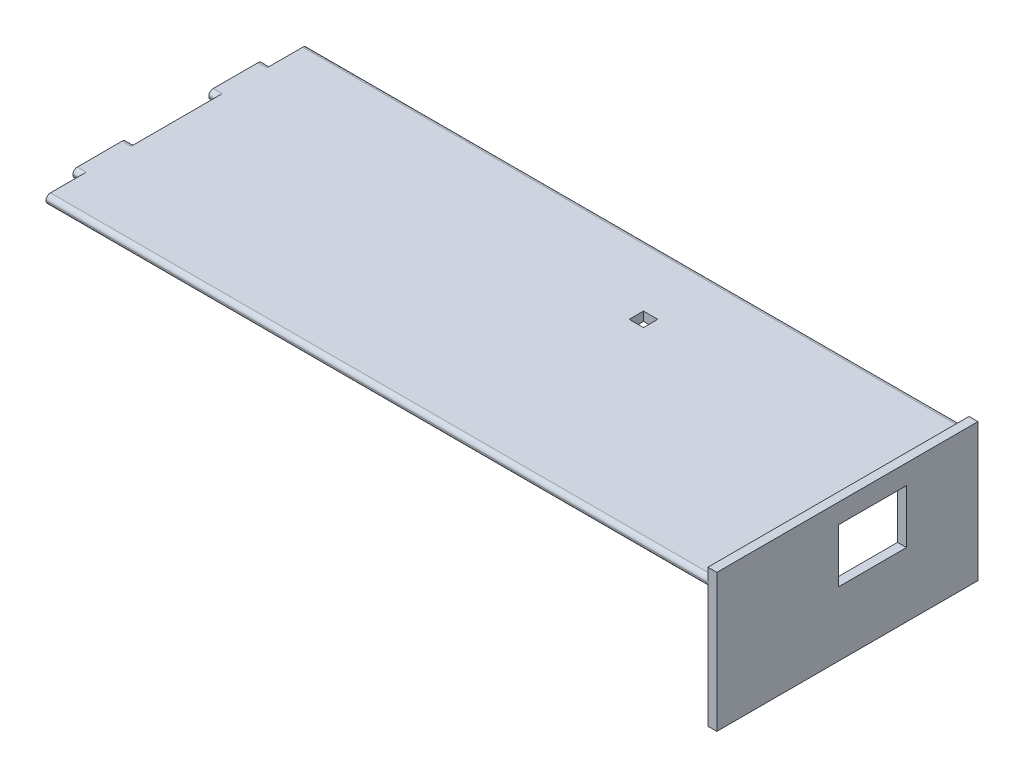
ISO-10303-21;
HEADER;
FILE_DESCRIPTION(('STEP AP214'),'2;1');
FILE_NAME('part.step','',(''),(''),'','','');
FILE_SCHEMA(('AUTOMOTIVE_DESIGN { 1 0 10303 214 1 1 1 1 }'));
ENDSEC;
DATA;
#1=APPLICATION_CONTEXT('core data for automotive mechanical design processes');
#2=APPLICATION_PROTOCOL_DEFINITION('international standard','automotive_design',2000,#1);
#3=PRODUCT_CONTEXT('',#1,'mechanical');
#4=PRODUCT('Part','Part','',(#3));
#5=PRODUCT_RELATED_PRODUCT_CATEGORY('part','',(#4));
#6=PRODUCT_DEFINITION_FORMATION('','',#4);
#7=PRODUCT_DEFINITION_CONTEXT('part definition',#1,'design');
#8=PRODUCT_DEFINITION('design','',#6,#7);
#9=PRODUCT_DEFINITION_SHAPE('','',#8);
#10=(LENGTH_UNIT() NAMED_UNIT(*) SI_UNIT(.MILLI.,.METRE.));
#11=(NAMED_UNIT(*) PLANE_ANGLE_UNIT() SI_UNIT($,.RADIAN.));
#12=(NAMED_UNIT(*) SI_UNIT($,.STERADIAN.) SOLID_ANGLE_UNIT());
#13=UNCERTAINTY_MEASURE_WITH_UNIT(LENGTH_MEASURE(1.E-05),#10,'distance_accuracy_value','');
#14=(GEOMETRIC_REPRESENTATION_CONTEXT(3) GLOBAL_UNCERTAINTY_ASSIGNED_CONTEXT((#13)) GLOBAL_UNIT_ASSIGNED_CONTEXT((#10,
#11,#12)) REPRESENTATION_CONTEXT('',''));
#15=CARTESIAN_POINT('',(0.,0.,0.));
#16=DIRECTION('',(0.,0.,1.));
#17=DIRECTION('',(1.,0.,0.));
#18=AXIS2_PLACEMENT_3D('',#15,#16,#17);
#19=CARTESIAN_POINT('',(-87.0064794816415,2.5,-44.1074514038877));
#20=DIRECTION('',(1.,0.,0.));
#21=DIRECTION('',(0.,0.,-1.));
#22=AXIS2_PLACEMENT_3D('',#19,#20,#21);
#23=PLANE('',#22);
#24=DIRECTION('',(0.,0.,1.));
#25=VECTOR('',#24,1.);
#26=CARTESIAN_POINT('',(-87.0064794816415,0.,-44.1074514038877));
#27=LINE('',#26,#25);
#28=CARTESIAN_POINT('',(-87.0064794816415,0.,-20.3574514038877));
#29=VERTEX_POINT('',#28);
#30=CARTESIAN_POINT('',(-87.0064794816415,0.,5.1425485961123));
#31=VERTEX_POINT('',#30);
#32=EDGE_CURVE('E362',#29,#31,#27,.T.);
#33=ORIENTED_EDGE('',*,*,#32,.T.);
#34=CARTESIAN_POINT('',(-87.0064794816415,1.25,5.1425485961123));
#35=DIRECTION('',(1.,0.,0.));
#36=DIRECTION('',(0.,0.,-1.));
#37=AXIS2_PLACEMENT_3D('',#34,#35,#36);
#38=CIRCLE('',#37,1.25);
#39=CARTESIAN_POINT('',(-87.0064794816415,1.25,3.8925485961123));
#40=VERTEX_POINT('',#39);
#41=EDGE_CURVE('E405',#31,#40,#38,.T.);
#42=ORIENTED_EDGE('',*,*,#41,.T.);
#43=CARTESIAN_POINT('',(-87.0064794816415,1.25,5.1425485961123));
#44=DIRECTION('',(1.,0.,0.));
#45=DIRECTION('',(0.,0.,-1.));
#46=AXIS2_PLACEMENT_3D('',#43,#44,#45);
#47=CIRCLE('',#46,1.25);
#48=CARTESIAN_POINT('',(-87.0064794816415,2.5,5.1425485961123));
#49=VERTEX_POINT('',#48);
#50=EDGE_CURVE('E402',#40,#49,#47,.T.);
#51=ORIENTED_EDGE('',*,*,#50,.T.);
#52=DIRECTION('',(0.,0.,1.));
#53=VECTOR('',#52,1.);
#54=CARTESIAN_POINT('',(-87.0064794816415,2.5,-44.1074514038877));
#55=LINE('',#54,#53);
#56=CARTESIAN_POINT('',(-87.0064794816415,2.5,-20.3574514038877));
#57=VERTEX_POINT('',#56);
#58=EDGE_CURVE('E354',#57,#49,#55,.T.);
#59=ORIENTED_EDGE('',*,*,#58,.F.);
#60=CARTESIAN_POINT('',(-87.0064794816415,1.25,-20.3574514038877));
#61=DIRECTION('',(1.,0.,0.));
#62=DIRECTION('',(0.,0.,-1.));
#63=AXIS2_PLACEMENT_3D('',#60,#61,#62);
#64=CIRCLE('',#63,1.25);
#65=CARTESIAN_POINT('',(-87.0064794816415,1.25,-19.1074514038877));
#66=VERTEX_POINT('',#65);
#67=EDGE_CURVE('E414',#57,#66,#64,.T.);
#68=ORIENTED_EDGE('',*,*,#67,.T.);
#69=CARTESIAN_POINT('',(-87.0064794816415,1.25,-20.3574514038877));
#70=DIRECTION('',(1.,0.,0.));
#71=DIRECTION('',(0.,0.,-1.));
#72=AXIS2_PLACEMENT_3D('',#69,#70,#71);
#73=CIRCLE('',#72,1.25);
#74=EDGE_CURVE('E416',#66,#29,#73,.T.);
#75=ORIENTED_EDGE('',*,*,#74,.T.);
#76=EDGE_LOOP('',(#33,#42,#51,#59,#68,#75));
#77=FACE_BOUND('',#76,.T.);
#78=ADVANCED_FACE('F37',(#77),#23,.F.);
#79=CARTESIAN_POINT('',(-87.0064794816415,0.,17.6425485961123));
#80=VERTEX_POINT('',#79);
#81=CARTESIAN_POINT('',(-87.0064794816415,0.,27.6425485961123));
#82=VERTEX_POINT('',#81);
#83=EDGE_CURVE('E350',#80,#82,#27,.T.);
#84=ORIENTED_EDGE('',*,*,#83,.T.);
#85=CARTESIAN_POINT('',(-87.0064794816415,1.25,27.6425485961123));
#86=DIRECTION('',(1.,0.,0.));
#87=DIRECTION('',(0.,0.,-1.));
#88=AXIS2_PLACEMENT_3D('',#85,#86,#87);
#89=CIRCLE('',#88,1.25);
#90=CARTESIAN_POINT('',(-87.0064794816415,1.25,28.8925485961123));
#91=VERTEX_POINT('',#90);
#92=EDGE_CURVE('E448',#82,#91,#89,.F.);
#93=ORIENTED_EDGE('',*,*,#92,.T.);
#94=CARTESIAN_POINT('',(-87.0064794816415,1.25,27.6425485961123));
#95=DIRECTION('',(1.,0.,0.));
#96=DIRECTION('',(0.,0.,-1.));
#97=AXIS2_PLACEMENT_3D('',#94,#95,#96);
#98=CIRCLE('',#97,1.25);
#99=CARTESIAN_POINT('',(-87.0064794816415,2.5,27.6425485961123));
#100=VERTEX_POINT('',#99);
#101=EDGE_CURVE('E446',#91,#100,#98,.F.);
#102=ORIENTED_EDGE('',*,*,#101,.T.);
#103=CARTESIAN_POINT('',(-87.0064794816415,2.5,17.6425485961123));
#104=VERTEX_POINT('',#103);
#105=EDGE_CURVE('E355',#104,#100,#55,.T.);
#106=ORIENTED_EDGE('',*,*,#105,.F.);
#107=CARTESIAN_POINT('',(-87.0064794816415,1.25,17.6425485961123));
#108=DIRECTION('',(1.,0.,0.));
#109=DIRECTION('',(0.,0.,-1.));
#110=AXIS2_PLACEMENT_3D('',#107,#108,#109);
#111=CIRCLE('',#110,1.25);
#112=CARTESIAN_POINT('',(-87.0064794816415,1.25,18.8925485961123));
#113=VERTEX_POINT('',#112);
#114=EDGE_CURVE('E410',#104,#113,#111,.T.);
#115=ORIENTED_EDGE('',*,*,#114,.T.);
#116=CARTESIAN_POINT('',(-87.0064794816415,1.25,17.6425485961123));
#117=DIRECTION('',(1.,0.,0.));
#118=DIRECTION('',(0.,0.,-1.));
#119=AXIS2_PLACEMENT_3D('',#116,#117,#118);
#120=CIRCLE('',#119,1.25);
#121=EDGE_CURVE('E407',#113,#80,#120,.T.);
#122=ORIENTED_EDGE('',*,*,#121,.T.);
#123=EDGE_LOOP('',(#84,#93,#102,#106,#115,#122));
#124=FACE_BOUND('',#123,.T.);
#125=ADVANCED_FACE('F473',(#124),#23,.F.);
#126=CARTESIAN_POINT('',(-87.0064794816415,1.25,-42.8574514038877));
#127=DIRECTION('',(1.,0.,0.));
#128=DIRECTION('',(0.,0.,-1.));
#129=AXIS2_PLACEMENT_3D('',#126,#127,#128);
#130=CIRCLE('',#129,1.25);
#131=CARTESIAN_POINT('',(-87.0064794816415,2.5,-42.8574514038877));
#132=VERTEX_POINT('',#131);
#133=CARTESIAN_POINT('',(-87.0064794816415,1.25,-44.1074514038877));
#134=VERTEX_POINT('',#133);
#135=EDGE_CURVE('E422',#132,#134,#130,.F.);
#136=ORIENTED_EDGE('',*,*,#135,.T.);
#137=CARTESIAN_POINT('',(-87.0064794816415,1.25,-42.8574514038877));
#138=DIRECTION('',(1.,0.,0.));
#139=DIRECTION('',(0.,0.,-1.));
#140=AXIS2_PLACEMENT_3D('',#137,#138,#139);
#141=CIRCLE('',#140,1.25);
#142=CARTESIAN_POINT('',(-87.0064794816415,0.,-42.8574514038877));
#143=VERTEX_POINT('',#142);
#144=EDGE_CURVE('E434',#134,#143,#141,.F.);
#145=ORIENTED_EDGE('',*,*,#144,.T.);
#146=CARTESIAN_POINT('',(-87.0064794816415,0.,-32.8574514038877));
#147=VERTEX_POINT('',#146);
#148=EDGE_CURVE('E359',#143,#147,#27,.T.);
#149=ORIENTED_EDGE('',*,*,#148,.T.);
#150=CARTESIAN_POINT('',(-87.0064794816415,1.25,-32.8574514038877));
#151=DIRECTION('',(1.,0.,0.));
#152=DIRECTION('',(0.,0.,-1.));
#153=AXIS2_PLACEMENT_3D('',#150,#151,#152);
#154=CIRCLE('',#153,1.25);
#155=CARTESIAN_POINT('',(-87.0064794816415,1.25,-34.1074514038877));
#156=VERTEX_POINT('',#155);
#157=EDGE_CURVE('E412',#147,#156,#154,.T.);
#158=ORIENTED_EDGE('',*,*,#157,.T.);
#159=CARTESIAN_POINT('',(-87.0064794816415,1.25,-32.8574514038877));
#160=DIRECTION('',(1.,0.,0.));
#161=DIRECTION('',(0.,0.,-1.));
#162=AXIS2_PLACEMENT_3D('',#159,#160,#161);
#163=CIRCLE('',#162,1.25);
#164=CARTESIAN_POINT('',(-87.0064794816415,2.5,-32.8574514038877));
#165=VERTEX_POINT('',#164);
#166=EDGE_CURVE('E419',#156,#165,#163,.T.);
#167=ORIENTED_EDGE('',*,*,#166,.T.);
#168=EDGE_CURVE('E351',#132,#165,#55,.T.);
#169=ORIENTED_EDGE('',*,*,#168,.F.);
#170=EDGE_LOOP('',(#136,#145,#149,#158,#167,#169));
#171=FACE_BOUND('',#170,.T.);
#172=ADVANCED_FACE('F540',(#171),#23,.F.);
#173=CARTESIAN_POINT('',(-87.0064794816415,2.5,28.8925485961123));
#174=DIRECTION('',(0.,0.,-1.));
#175=DIRECTION('',(-1.,0.,0.));
#176=AXIS2_PLACEMENT_3D('',#173,#174,#175);
#177=PLANE('',#176);
#178=DIRECTION('',(0.,-1.,0.));
#179=VECTOR('',#178,1.);
#180=CARTESIAN_POINT('',(97.9935205183586,5.,28.8925485961123));
#181=LINE('',#180,#179);
#182=CARTESIAN_POINT('',(97.9935205183586,5.,28.8925485961123));
#183=VERTEX_POINT('',#182);
#184=CARTESIAN_POINT('',(97.9935205183586,1.25,28.8925485961123));
#185=VERTEX_POINT('',#184);
#186=EDGE_CURVE('E315',#183,#185,#181,.T.);
#187=ORIENTED_EDGE('',*,*,#186,.T.);
#188=CARTESIAN_POINT('',(97.9935205183586,-33.5,28.8925485961123));
#189=VERTEX_POINT('',#188);
#190=EDGE_CURVE('E318',#185,#189,#181,.T.);
#191=ORIENTED_EDGE('',*,*,#190,.T.);
#192=DIRECTION('',(-1.,0.,0.));
#193=VECTOR('',#192,1.);
#194=CARTESIAN_POINT('',(100.493520518359,-33.5,28.8925485961123));
#195=LINE('',#194,#193);
#196=CARTESIAN_POINT('',(100.493520518359,-33.5,28.8925485961123));
#197=VERTEX_POINT('',#196);
#198=EDGE_CURVE('E333',#197,#189,#195,.T.);
#199=ORIENTED_EDGE('',*,*,#198,.F.);
#200=DIRECTION('',(0.,-1.,0.));
#201=VECTOR('',#200,1.);
#202=CARTESIAN_POINT('',(100.493520518359,5.,28.8925485961123));
#203=LINE('',#202,#201);
#204=CARTESIAN_POINT('',(100.493520518359,5.,28.8925485961123));
#205=VERTEX_POINT('',#204);
#206=EDGE_CURVE('E304',#205,#197,#203,.T.);
#207=ORIENTED_EDGE('',*,*,#206,.F.);
#208=DIRECTION('',(-1.,0.,0.));
#209=VECTOR('',#208,1.);
#210=CARTESIAN_POINT('',(100.493520518359,5.,28.8925485961123));
#211=LINE('',#210,#209);
#212=EDGE_CURVE('E314',#205,#183,#211,.T.);
#213=ORIENTED_EDGE('',*,*,#212,.T.);
#214=EDGE_LOOP('',(#187,#191,#199,#207,#213));
#215=FACE_BOUND('',#214,.T.);
#216=ADVANCED_FACE('F567',(#215),#177,.F.);
#217=CARTESIAN_POINT('',(-87.0064794816415,2.5,-44.1074514038877));
#218=DIRECTION('',(0.,0.,1.));
#219=DIRECTION('',(1.,0.,0.));
#220=AXIS2_PLACEMENT_3D('',#217,#218,#219);
#221=PLANE('',#220);
#222=DIRECTION('',(0.,1.,0.));
#223=VECTOR('',#222,1.);
#224=CARTESIAN_POINT('',(97.9935205183586,5.,-44.1074514038877));
#225=LINE('',#224,#223);
#226=CARTESIAN_POINT('',(97.9935205183586,-33.5,-44.1074514038877));
#227=VERTEX_POINT('',#226);
#228=CARTESIAN_POINT('',(97.9935205183586,1.25,-44.1074514038877));
#229=VERTEX_POINT('',#228);
#230=EDGE_CURVE('E321',#227,#229,#225,.T.);
#231=ORIENTED_EDGE('',*,*,#230,.T.);
#232=CARTESIAN_POINT('',(97.9935205183586,5.,-44.1074514038877));
#233=VERTEX_POINT('',#232);
#234=EDGE_CURVE('E320',#229,#233,#225,.T.);
#235=ORIENTED_EDGE('',*,*,#234,.T.);
#236=DIRECTION('',(-1.,0.,0.));
#237=VECTOR('',#236,1.);
#238=CARTESIAN_POINT('',(100.493520518359,5.,-44.1074514038877));
#239=LINE('',#238,#237);
#240=CARTESIAN_POINT('',(100.493520518359,5.,-44.1074514038877));
#241=VERTEX_POINT('',#240);
#242=EDGE_CURVE('E327',#241,#233,#239,.T.);
#243=ORIENTED_EDGE('',*,*,#242,.F.);
#244=DIRECTION('',(0.,1.,0.));
#245=VECTOR('',#244,1.);
#246=CARTESIAN_POINT('',(100.493520518359,5.,-44.1074514038877));
#247=LINE('',#246,#245);
#248=CARTESIAN_POINT('',(100.493520518359,-33.5,-44.1074514038877));
#249=VERTEX_POINT('',#248);
#250=EDGE_CURVE('E310',#249,#241,#247,.T.);
#251=ORIENTED_EDGE('',*,*,#250,.F.);
#252=DIRECTION('',(-1.,0.,0.));
#253=VECTOR('',#252,1.);
#254=CARTESIAN_POINT('',(100.493520518359,-33.5,-44.1074514038877));
#255=LINE('',#254,#253);
#256=EDGE_CURVE('E330',#249,#227,#255,.T.);
#257=ORIENTED_EDGE('',*,*,#256,.T.);
#258=EDGE_LOOP('',(#231,#235,#243,#251,#257));
#259=FACE_BOUND('',#258,.T.);
#260=ADVANCED_FACE('F571',(#259),#221,.F.);
#261=CARTESIAN_POINT('',(0.,2.5,0.));
#262=DIRECTION('',(0.,1.,0.));
#263=DIRECTION('',(0.,0.,1.));
#264=AXIS2_PLACEMENT_3D('',#261,#262,#263);
#265=PLANE('',#264);
#266=DIRECTION('',(0.,0.,1.));
#267=VECTOR('',#266,1.);
#268=CARTESIAN_POINT('',(24.4935205183586,2.5,-26.6074514038877));
#269=LINE('',#268,#267);
#270=CARTESIAN_POINT('',(24.4935205183586,2.5,-26.6074514038877));
#271=VERTEX_POINT('',#270);
#272=CARTESIAN_POINT('',(24.4935205183586,2.5,-22.6074514038877));
#273=VERTEX_POINT('',#272);
#274=EDGE_CURVE('E54',#271,#273,#269,.T.);
#275=ORIENTED_EDGE('',*,*,#274,.F.);
#276=DIRECTION('',(-1.,0.,0.));
#277=VECTOR('',#276,1.);
#278=CARTESIAN_POINT('',(24.4935205183586,2.5,-26.6074514038877));
#279=LINE('',#278,#277);
#280=CARTESIAN_POINT('',(28.4935205183586,2.5,-26.6074514038877));
#281=VERTEX_POINT('',#280);
#282=EDGE_CURVE('E254',#281,#271,#279,.T.);
#283=ORIENTED_EDGE('',*,*,#282,.F.);
#284=DIRECTION('',(0.,0.,-1.));
#285=VECTOR('',#284,1.);
#286=CARTESIAN_POINT('',(28.4935205183586,2.5,-26.6074514038877));
#287=LINE('',#286,#285);
#288=CARTESIAN_POINT('',(28.4935205183586,2.5,-22.6074514038877));
#289=VERTEX_POINT('',#288);
#290=EDGE_CURVE('E257',#289,#281,#287,.T.);
#291=ORIENTED_EDGE('',*,*,#290,.F.);
#292=DIRECTION('',(1.,0.,0.));
#293=VECTOR('',#292,1.);
#294=CARTESIAN_POINT('',(24.4935205183586,2.5,-22.6074514038877));
#295=LINE('',#294,#293);
#296=EDGE_CURVE('E263',#273,#289,#295,.T.);
#297=ORIENTED_EDGE('',*,*,#296,.F.);
#298=EDGE_LOOP('',(#275,#283,#291,#297));
#299=FACE_BOUND('',#298,.T.);
#300=DIRECTION('',(0.,0.,-1.));
#301=VECTOR('',#300,1.);
#302=CARTESIAN_POINT('',(97.9935205183586,2.5,-44.1074514038877));
#303=LINE('',#302,#301);
#304=CARTESIAN_POINT('',(97.9935205183586,2.5,27.6425485961123));
#305=VERTEX_POINT('',#304);
#306=CARTESIAN_POINT('',(97.9935205183586,2.5,-42.8574514038877));
#307=VERTEX_POINT('',#306);
#308=EDGE_CURVE('E353',#305,#307,#303,.T.);
#309=ORIENTED_EDGE('',*,*,#308,.T.);
#310=DIRECTION('',(-1.,0.,0.));
#311=VECTOR('',#310,1.);
#312=CARTESIAN_POINT('',(-87.0064794816415,2.5,-42.8574514038877));
#313=LINE('',#312,#311);
#314=EDGE_CURVE('E444',#307,#132,#313,.T.);
#315=ORIENTED_EDGE('',*,*,#314,.T.);
#316=ORIENTED_EDGE('',*,*,#168,.T.);
#317=DIRECTION('',(1.,0.,0.));
#318=VECTOR('',#317,1.);
#319=CARTESIAN_POINT('',(-89.5064794816415,2.5,-32.8574514038877));
#320=LINE('',#319,#318);
#321=CARTESIAN_POINT('',(-89.5064794816415,2.5,-32.8574514038877));
#322=VERTEX_POINT('',#321);
#323=EDGE_CURVE('E358',#165,#322,#320,.F.);
#324=ORIENTED_EDGE('',*,*,#323,.T.);
#325=DIRECTION('',(0.,0.,-1.));
#326=VECTOR('',#325,1.);
#327=CARTESIAN_POINT('',(-89.5064794816415,2.5,-34.1074514038877));
#328=LINE('',#327,#326);
#329=CARTESIAN_POINT('',(-89.5064794816415,2.5,-20.3574514038877));
#330=VERTEX_POINT('',#329);
#331=EDGE_CURVE('E347',#330,#322,#328,.T.);
#332=ORIENTED_EDGE('',*,*,#331,.F.);
#333=DIRECTION('',(1.,0.,0.));
#334=VECTOR('',#333,1.);
#335=CARTESIAN_POINT('',(-87.0064794816415,2.5,-20.3574514038877));
#336=LINE('',#335,#334);
#337=EDGE_CURVE('E366',#330,#57,#336,.T.);
#338=ORIENTED_EDGE('',*,*,#337,.T.);
#339=ORIENTED_EDGE('',*,*,#58,.T.);
#340=DIRECTION('',(1.,0.,0.));
#341=VECTOR('',#340,1.);
#342=CARTESIAN_POINT('',(-89.5064794816415,2.5,5.1425485961123));
#343=LINE('',#342,#341);
#344=CARTESIAN_POINT('',(-89.5064794816415,2.5,5.1425485961123));
#345=VERTEX_POINT('',#344);
#346=EDGE_CURVE('E372',#49,#345,#343,.F.);
#347=ORIENTED_EDGE('',*,*,#346,.T.);
#348=DIRECTION('',(0.,0.,-1.));
#349=VECTOR('',#348,1.);
#350=CARTESIAN_POINT('',(-89.5064794816415,2.5,3.8925485961123));
#351=LINE('',#350,#349);
#352=CARTESIAN_POINT('',(-89.5064794816415,2.5,17.6425485961123));
#353=VERTEX_POINT('',#352);
#354=EDGE_CURVE('E340',#353,#345,#351,.T.);
#355=ORIENTED_EDGE('',*,*,#354,.F.);
#356=DIRECTION('',(1.,0.,0.));
#357=VECTOR('',#356,1.);
#358=CARTESIAN_POINT('',(-87.0064794816415,2.5,17.6425485961123));
#359=LINE('',#358,#357);
#360=EDGE_CURVE('E369',#353,#104,#359,.T.);
#361=ORIENTED_EDGE('',*,*,#360,.T.);
#362=ORIENTED_EDGE('',*,*,#105,.T.);
#363=DIRECTION('',(1.,0.,0.));
#364=VECTOR('',#363,1.);
#365=CARTESIAN_POINT('',(97.9935205183586,2.5,27.6425485961123));
#366=LINE('',#365,#364);
#367=EDGE_CURVE('E442',#100,#305,#366,.T.);
#368=ORIENTED_EDGE('',*,*,#367,.T.);
#369=EDGE_LOOP('',(#309,#315,#316,#324,#332,#338,#339,#347,#355,#361,#362,#368));
#370=FACE_BOUND('',#369,.T.);
#371=ADVANCED_FACE('F475',(#299,#370),#265,.T.);
#372=CARTESIAN_POINT('',(0.,0.,0.));
#373=DIRECTION('',(0.,1.,0.));
#374=DIRECTION('',(0.,0.,1.));
#375=AXIS2_PLACEMENT_3D('',#372,#373,#374);
#376=PLANE('',#375);
#377=DIRECTION('',(-1.,0.,0.));
#378=VECTOR('',#377,1.);
#379=CARTESIAN_POINT('',(24.4935205183586,0.,-26.6074514038877));
#380=LINE('',#379,#378);
#381=CARTESIAN_POINT('',(28.4935205183586,0.,-26.6074514038877));
#382=VERTEX_POINT('',#381);
#383=CARTESIAN_POINT('',(24.4935205183586,0.,-26.6074514038877));
#384=VERTEX_POINT('',#383);
#385=EDGE_CURVE('E244',#382,#384,#380,.T.);
#386=ORIENTED_EDGE('',*,*,#385,.T.);
#387=DIRECTION('',(0.,0.,1.));
#388=VECTOR('',#387,1.);
#389=CARTESIAN_POINT('',(24.4935205183586,0.,-26.6074514038877));
#390=LINE('',#389,#388);
#391=CARTESIAN_POINT('',(24.4935205183586,0.,-22.6074514038877));
#392=VERTEX_POINT('',#391);
#393=EDGE_CURVE('E238',#384,#392,#390,.T.);
#394=ORIENTED_EDGE('',*,*,#393,.T.);
#395=DIRECTION('',(1.,0.,0.));
#396=VECTOR('',#395,1.);
#397=CARTESIAN_POINT('',(24.4935205183586,0.,-22.6074514038877));
#398=LINE('',#397,#396);
#399=CARTESIAN_POINT('',(28.4935205183586,0.,-22.6074514038877));
#400=VERTEX_POINT('',#399);
#401=EDGE_CURVE('E247',#392,#400,#398,.T.);
#402=ORIENTED_EDGE('',*,*,#401,.T.);
#403=DIRECTION('',(0.,0.,-1.));
#404=VECTOR('',#403,1.);
#405=CARTESIAN_POINT('',(28.4935205183586,0.,-26.6074514038877));
#406=LINE('',#405,#404);
#407=EDGE_CURVE('E62',#400,#382,#406,.T.);
#408=ORIENTED_EDGE('',*,*,#407,.T.);
#409=EDGE_LOOP('',(#386,#394,#402,#408));
#410=FACE_BOUND('',#409,.T.);
#411=ORIENTED_EDGE('',*,*,#148,.F.);
#412=DIRECTION('',(-1.,0.,0.));
#413=VECTOR('',#412,1.);
#414=CARTESIAN_POINT('',(0.,0.,-42.8574514038877));
#415=LINE('',#414,#413);
#416=CARTESIAN_POINT('',(97.9935205183586,0.,-42.8574514038877));
#417=VERTEX_POINT('',#416);
#418=EDGE_CURVE('E439',#143,#417,#415,.F.);
#419=ORIENTED_EDGE('',*,*,#418,.T.);
#420=DIRECTION('',(0.,0.,-1.));
#421=VECTOR('',#420,1.);
#422=CARTESIAN_POINT('',(97.9935205183586,0.,-44.1074514038877));
#423=LINE('',#422,#421);
#424=CARTESIAN_POINT('',(97.9935205183586,0.,27.6425485961123));
#425=VERTEX_POINT('',#424);
#426=EDGE_CURVE('E361',#425,#417,#423,.T.);
#427=ORIENTED_EDGE('',*,*,#426,.F.);
#428=DIRECTION('',(1.,0.,0.));
#429=VECTOR('',#428,1.);
#430=CARTESIAN_POINT('',(0.,0.,27.6425485961123));
#431=LINE('',#430,#429);
#432=EDGE_CURVE('E436',#425,#82,#431,.F.);
#433=ORIENTED_EDGE('',*,*,#432,.T.);
#434=ORIENTED_EDGE('',*,*,#83,.F.);
#435=DIRECTION('',(1.,0.,0.));
#436=VECTOR('',#435,1.);
#437=CARTESIAN_POINT('',(0.,0.,17.6425485961123));
#438=LINE('',#437,#436);
#439=CARTESIAN_POINT('',(-89.5064794816415,0.,17.6425485961123));
#440=VERTEX_POINT('',#439);
#441=EDGE_CURVE('E388',#80,#440,#438,.F.);
#442=ORIENTED_EDGE('',*,*,#441,.T.);
#443=DIRECTION('',(0.,0.,1.));
#444=VECTOR('',#443,1.);
#445=CARTESIAN_POINT('',(-89.5064794816415,0.,3.8925485961123));
#446=LINE('',#445,#444);
#447=CARTESIAN_POINT('',(-89.5064794816415,0.,5.1425485961123));
#448=VERTEX_POINT('',#447);
#449=EDGE_CURVE('E337',#448,#440,#446,.T.);
#450=ORIENTED_EDGE('',*,*,#449,.F.);
#451=DIRECTION('',(1.,0.,0.));
#452=VECTOR('',#451,1.);
#453=CARTESIAN_POINT('',(0.,0.,5.1425485961123));
#454=LINE('',#453,#452);
#455=EDGE_CURVE('E391',#448,#31,#454,.T.);
#456=ORIENTED_EDGE('',*,*,#455,.T.);
#457=ORIENTED_EDGE('',*,*,#32,.F.);
#458=DIRECTION('',(1.,0.,0.));
#459=VECTOR('',#458,1.);
#460=CARTESIAN_POINT('',(0.,0.,-20.3574514038877));
#461=LINE('',#460,#459);
#462=CARTESIAN_POINT('',(-89.5064794816415,0.,-20.3574514038877));
#463=VERTEX_POINT('',#462);
#464=EDGE_CURVE('E383',#29,#463,#461,.F.);
#465=ORIENTED_EDGE('',*,*,#464,.T.);
#466=DIRECTION('',(0.,0.,1.));
#467=VECTOR('',#466,1.);
#468=CARTESIAN_POINT('',(-89.5064794816415,0.,-34.1074514038877));
#469=LINE('',#468,#467);
#470=CARTESIAN_POINT('',(-89.5064794816415,0.,-32.8574514038877));
#471=VERTEX_POINT('',#470);
#472=EDGE_CURVE('E344',#471,#463,#469,.T.);
#473=ORIENTED_EDGE('',*,*,#472,.F.);
#474=DIRECTION('',(1.,0.,0.));
#475=VECTOR('',#474,1.);
#476=CARTESIAN_POINT('',(0.,0.,-32.8574514038877));
#477=LINE('',#476,#475);
#478=EDGE_CURVE('E385',#471,#147,#477,.T.);
#479=ORIENTED_EDGE('',*,*,#478,.T.);
#480=EDGE_LOOP('',(#411,#419,#427,#433,#434,#442,#450,#456,#457,#465,#473,#479));
#481=FACE_BOUND('',#480,.T.);
#482=ADVANCED_FACE('F251',(#410,#481),#376,.F.);
#483=CARTESIAN_POINT('',(-89.5064794816415,0.,0.));
#484=DIRECTION('',(-1.,0.,0.));
#485=DIRECTION('',(0.,0.,1.));
#486=AXIS2_PLACEMENT_3D('',#483,#484,#485);
#487=PLANE('',#486);
#488=CARTESIAN_POINT('',(-89.5064794816415,1.25,-20.3574514038877));
#489=DIRECTION('',(-1.,0.,0.));
#490=DIRECTION('',(0.,0.,1.));
#491=AXIS2_PLACEMENT_3D('',#488,#489,#490);
#492=CIRCLE('',#491,1.25);
#493=CARTESIAN_POINT('',(-89.5064794816415,1.25,-19.1074514038877));
#494=VERTEX_POINT('',#493);
#495=EDGE_CURVE('E398',#463,#494,#492,.T.);
#496=ORIENTED_EDGE('',*,*,#495,.T.);
#497=CARTESIAN_POINT('',(-89.5064794816415,1.25,-20.3574514038877));
#498=DIRECTION('',(-1.,0.,0.));
#499=DIRECTION('',(0.,0.,1.));
#500=AXIS2_PLACEMENT_3D('',#497,#498,#499);
#501=CIRCLE('',#500,1.25);
#502=EDGE_CURVE('E400',#494,#330,#501,.T.);
#503=ORIENTED_EDGE('',*,*,#502,.T.);
#504=ORIENTED_EDGE('',*,*,#331,.T.);
#505=CARTESIAN_POINT('',(-89.5064794816415,1.25,-32.8574514038877));
#506=DIRECTION('',(-1.,0.,0.));
#507=DIRECTION('',(0.,0.,1.));
#508=AXIS2_PLACEMENT_3D('',#505,#506,#507);
#509=CIRCLE('',#508,1.25);
#510=CARTESIAN_POINT('',(-89.5064794816415,1.25,-34.1074514038877));
#511=VERTEX_POINT('',#510);
#512=EDGE_CURVE('E394',#322,#511,#509,.T.);
#513=ORIENTED_EDGE('',*,*,#512,.T.);
#514=CARTESIAN_POINT('',(-89.5064794816415,1.25,-32.8574514038877));
#515=DIRECTION('',(-1.,0.,0.));
#516=DIRECTION('',(0.,0.,1.));
#517=AXIS2_PLACEMENT_3D('',#514,#515,#516);
#518=CIRCLE('',#517,1.25);
#519=EDGE_CURVE('E396',#511,#471,#518,.T.);
#520=ORIENTED_EDGE('',*,*,#519,.T.);
#521=ORIENTED_EDGE('',*,*,#472,.T.);
#522=EDGE_LOOP('',(#496,#503,#504,#513,#520,#521));
#523=FACE_BOUND('',#522,.T.);
#524=ADVANCED_FACE('F515',(#523),#487,.T.);
#525=CARTESIAN_POINT('',(-89.5064794816415,0.,0.));
#526=DIRECTION('',(-1.,0.,0.));
#527=DIRECTION('',(0.,0.,1.));
#528=AXIS2_PLACEMENT_3D('',#525,#526,#527);
#529=PLANE('',#528);
#530=ORIENTED_EDGE('',*,*,#354,.T.);
#531=CARTESIAN_POINT('',(-89.5064794816415,1.25,5.1425485961123));
#532=DIRECTION('',(-1.,0.,0.));
#533=DIRECTION('',(0.,0.,1.));
#534=AXIS2_PLACEMENT_3D('',#531,#532,#533);
#535=CIRCLE('',#534,1.25);
#536=CARTESIAN_POINT('',(-89.5064794816415,1.25,3.8925485961123));
#537=VERTEX_POINT('',#536);
#538=EDGE_CURVE('E381',#345,#537,#535,.T.);
#539=ORIENTED_EDGE('',*,*,#538,.T.);
#540=CARTESIAN_POINT('',(-89.5064794816415,1.25,5.1425485961123));
#541=DIRECTION('',(-1.,0.,0.));
#542=DIRECTION('',(0.,0.,1.));
#543=AXIS2_PLACEMENT_3D('',#540,#541,#542);
#544=CIRCLE('',#543,1.25);
#545=EDGE_CURVE('E379',#537,#448,#544,.T.);
#546=ORIENTED_EDGE('',*,*,#545,.T.);
#547=ORIENTED_EDGE('',*,*,#449,.T.);
#548=CARTESIAN_POINT('',(-89.5064794816415,1.25,17.6425485961123));
#549=DIRECTION('',(-1.,0.,0.));
#550=DIRECTION('',(0.,0.,1.));
#551=AXIS2_PLACEMENT_3D('',#548,#549,#550);
#552=CIRCLE('',#551,1.25);
#553=CARTESIAN_POINT('',(-89.5064794816415,1.25,18.8925485961123));
#554=VERTEX_POINT('',#553);
#555=EDGE_CURVE('E377',#440,#554,#552,.T.);
#556=ORIENTED_EDGE('',*,*,#555,.T.);
#557=CARTESIAN_POINT('',(-89.5064794816415,1.25,17.6425485961123));
#558=DIRECTION('',(-1.,0.,0.));
#559=DIRECTION('',(0.,0.,1.));
#560=AXIS2_PLACEMENT_3D('',#557,#558,#559);
#561=CIRCLE('',#560,1.25);
#562=EDGE_CURVE('E375',#554,#353,#561,.T.);
#563=ORIENTED_EDGE('',*,*,#562,.T.);
#564=EDGE_LOOP('',(#530,#539,#546,#547,#556,#563));
#565=FACE_BOUND('',#564,.T.);
#566=ADVANCED_FACE('F492',(#565),#529,.T.);
#567=CARTESIAN_POINT('',(0.,1.25,5.1425485961123));
#568=DIRECTION('',(1.,0.,0.));
#569=DIRECTION('',(0.,0.,-1.));
#570=AXIS2_PLACEMENT_3D('',#567,#568,#569);
#571=CYLINDRICAL_SURFACE('',#570,1.25);
#572=ORIENTED_EDGE('',*,*,#455,.F.);
#573=ORIENTED_EDGE('',*,*,#545,.F.);
#574=DIRECTION('',(1.,0.,0.));
#575=VECTOR('',#574,1.);
#576=CARTESIAN_POINT('',(-89.5064794816415,1.25,3.8925485961123));
#577=LINE('',#576,#575);
#578=EDGE_CURVE('E341',#40,#537,#577,.F.);
#579=ORIENTED_EDGE('',*,*,#578,.F.);
#580=ORIENTED_EDGE('',*,*,#41,.F.);
#581=EDGE_LOOP('',(#572,#573,#579,#580));
#582=FACE_BOUND('',#581,.T.);
#583=ADVANCED_FACE('F496',(#582),#571,.T.);
#584=CARTESIAN_POINT('',(-89.5064794816415,1.25,5.1425485961123));
#585=DIRECTION('',(-1.,0.,0.));
#586=DIRECTION('',(0.,0.,1.));
#587=AXIS2_PLACEMENT_3D('',#584,#585,#586);
#588=CYLINDRICAL_SURFACE('',#587,1.25);
#589=ORIENTED_EDGE('',*,*,#538,.F.);
#590=ORIENTED_EDGE('',*,*,#346,.F.);
#591=ORIENTED_EDGE('',*,*,#50,.F.);
#592=ORIENTED_EDGE('',*,*,#578,.T.);
#593=EDGE_LOOP('',(#589,#590,#591,#592));
#594=FACE_BOUND('',#593,.T.);
#595=ADVANCED_FACE('F489',(#594),#588,.T.);
#596=CARTESIAN_POINT('',(0.,1.25,17.6425485961123));
#597=DIRECTION('',(-1.,0.,0.));
#598=DIRECTION('',(0.,0.,1.));
#599=AXIS2_PLACEMENT_3D('',#596,#597,#598);
#600=CYLINDRICAL_SURFACE('',#599,1.25);
#601=ORIENTED_EDGE('',*,*,#360,.F.);
#602=ORIENTED_EDGE('',*,*,#562,.F.);
#603=DIRECTION('',(1.,0.,0.));
#604=VECTOR('',#603,1.);
#605=CARTESIAN_POINT('',(-89.5064794816415,1.25,18.8925485961123));
#606=LINE('',#605,#604);
#607=EDGE_CURVE('E425',#113,#554,#606,.F.);
#608=ORIENTED_EDGE('',*,*,#607,.F.);
#609=ORIENTED_EDGE('',*,*,#114,.F.);
#610=EDGE_LOOP('',(#601,#602,#608,#609));
#611=FACE_BOUND('',#610,.T.);
#612=ADVANCED_FACE('F503',(#611),#600,.T.);
#613=CARTESIAN_POINT('',(-89.5064794816415,1.25,17.6425485961123));
#614=DIRECTION('',(1.,0.,0.));
#615=DIRECTION('',(0.,0.,-1.));
#616=AXIS2_PLACEMENT_3D('',#613,#614,#615);
#617=CYLINDRICAL_SURFACE('',#616,1.25);
#618=ORIENTED_EDGE('',*,*,#555,.F.);
#619=ORIENTED_EDGE('',*,*,#441,.F.);
#620=ORIENTED_EDGE('',*,*,#121,.F.);
#621=ORIENTED_EDGE('',*,*,#607,.T.);
#622=EDGE_LOOP('',(#618,#619,#620,#621));
#623=FACE_BOUND('',#622,.T.);
#624=ADVANCED_FACE('F505',(#623),#617,.T.);
#625=CARTESIAN_POINT('',(-89.5064794816415,1.25,-32.8574514038877));
#626=DIRECTION('',(-1.,0.,0.));
#627=DIRECTION('',(0.,0.,1.));
#628=AXIS2_PLACEMENT_3D('',#625,#626,#627);
#629=CYLINDRICAL_SURFACE('',#628,1.25);
#630=DIRECTION('',(1.,0.,0.));
#631=VECTOR('',#630,1.);
#632=CARTESIAN_POINT('',(-87.0064794816415,1.25,-34.1074514038877));
#633=LINE('',#632,#631);
#634=EDGE_CURVE('E428',#511,#156,#633,.T.);
#635=ORIENTED_EDGE('',*,*,#634,.F.);
#636=ORIENTED_EDGE('',*,*,#512,.F.);
#637=ORIENTED_EDGE('',*,*,#323,.F.);
#638=ORIENTED_EDGE('',*,*,#166,.F.);
#639=EDGE_LOOP('',(#635,#636,#637,#638));
#640=FACE_BOUND('',#639,.T.);
#641=ADVANCED_FACE('F544',(#640),#629,.T.);
#642=CARTESIAN_POINT('',(0.,1.25,-32.8574514038877));
#643=DIRECTION('',(1.,0.,0.));
#644=DIRECTION('',(0.,0.,-1.));
#645=AXIS2_PLACEMENT_3D('',#642,#643,#644);
#646=CYLINDRICAL_SURFACE('',#645,1.25);
#647=ORIENTED_EDGE('',*,*,#519,.F.);
#648=ORIENTED_EDGE('',*,*,#634,.T.);
#649=ORIENTED_EDGE('',*,*,#157,.F.);
#650=ORIENTED_EDGE('',*,*,#478,.F.);
#651=EDGE_LOOP('',(#647,#648,#649,#650));
#652=FACE_BOUND('',#651,.T.);
#653=ADVANCED_FACE('F520',(#652),#646,.T.);
#654=CARTESIAN_POINT('',(-89.5064794816415,1.25,-20.3574514038877));
#655=DIRECTION('',(1.,0.,0.));
#656=DIRECTION('',(0.,0.,-1.));
#657=AXIS2_PLACEMENT_3D('',#654,#655,#656);
#658=CYLINDRICAL_SURFACE('',#657,1.25);
#659=DIRECTION('',(1.,0.,0.));
#660=VECTOR('',#659,1.);
#661=CARTESIAN_POINT('',(-89.5064794816415,1.25,-19.1074514038877));
#662=LINE('',#661,#660);
#663=EDGE_CURVE('E336',#494,#66,#662,.T.);
#664=ORIENTED_EDGE('',*,*,#663,.F.);
#665=ORIENTED_EDGE('',*,*,#495,.F.);
#666=ORIENTED_EDGE('',*,*,#464,.F.);
#667=ORIENTED_EDGE('',*,*,#74,.F.);
#668=EDGE_LOOP('',(#664,#665,#666,#667));
#669=FACE_BOUND('',#668,.T.);
#670=ADVANCED_FACE('F511',(#669),#658,.T.);
#671=CARTESIAN_POINT('',(0.,1.25,-20.3574514038877));
#672=DIRECTION('',(-1.,0.,0.));
#673=DIRECTION('',(0.,0.,1.));
#674=AXIS2_PLACEMENT_3D('',#671,#672,#673);
#675=CYLINDRICAL_SURFACE('',#674,1.25);
#676=ORIENTED_EDGE('',*,*,#502,.F.);
#677=ORIENTED_EDGE('',*,*,#663,.T.);
#678=ORIENTED_EDGE('',*,*,#67,.F.);
#679=ORIENTED_EDGE('',*,*,#337,.F.);
#680=EDGE_LOOP('',(#676,#677,#678,#679));
#681=FACE_BOUND('',#680,.T.);
#682=ADVANCED_FACE('F547',(#681),#675,.T.);
#683=CARTESIAN_POINT('',(97.9935205183586,0.,0.));
#684=DIRECTION('',(1.,0.,0.));
#685=DIRECTION('',(0.,0.,-1.));
#686=AXIS2_PLACEMENT_3D('',#683,#684,#685);
#687=PLANE('',#686);
#688=DIRECTION('',(0.,0.,1.));
#689=VECTOR('',#688,1.);
#690=CARTESIAN_POINT('',(97.9935205183586,-0.500000000000004,-5.10745140388768));
#691=LINE('',#690,#689);
#692=CARTESIAN_POINT('',(97.9935205183586,-0.500000000000004,-24.1074514038877));
#693=VERTEX_POINT('',#692);
#694=CARTESIAN_POINT('',(97.9935205183586,-0.500000000000004,-5.10745140388768));
#695=VERTEX_POINT('',#694);
#696=EDGE_CURVE('E283',#693,#695,#691,.T.);
#697=ORIENTED_EDGE('',*,*,#696,.T.);
#698=DIRECTION('',(0.,-1.,0.));
#699=VECTOR('',#698,1.);
#700=CARTESIAN_POINT('',(97.9935205183586,-0.500000000000004,-5.10745140388768));
#701=LINE('',#700,#699);
#702=CARTESIAN_POINT('',(97.9935205183586,-15.5,-5.10745140388769));
#703=VERTEX_POINT('',#702);
#704=EDGE_CURVE('E273',#695,#703,#701,.T.);
#705=ORIENTED_EDGE('',*,*,#704,.T.);
#706=DIRECTION('',(0.,0.,-1.));
#707=VECTOR('',#706,1.);
#708=CARTESIAN_POINT('',(97.9935205183586,-15.5,-5.10745140388769));
#709=LINE('',#708,#707);
#710=CARTESIAN_POINT('',(97.9935205183586,-15.5,-24.1074514038877));
#711=VERTEX_POINT('',#710);
#712=EDGE_CURVE('E276',#703,#711,#709,.T.);
#713=ORIENTED_EDGE('',*,*,#712,.T.);
#714=DIRECTION('',(0.,1.,0.));
#715=VECTOR('',#714,1.);
#716=CARTESIAN_POINT('',(97.9935205183586,-0.500000000000004,-24.1074514038877));
#717=LINE('',#716,#715);
#718=EDGE_CURVE('E280',#711,#693,#717,.T.);
#719=ORIENTED_EDGE('',*,*,#718,.T.);
#720=EDGE_LOOP('',(#697,#705,#713,#719));
#721=FACE_BOUND('',#720,.T.);
#722=ORIENTED_EDGE('',*,*,#190,.F.);
#723=CARTESIAN_POINT('',(97.9935205183587,1.25,27.6425485961123));
#724=DIRECTION('',(1.,0.,0.));
#725=DIRECTION('',(0.,0.,-1.));
#726=AXIS2_PLACEMENT_3D('',#723,#724,#725);
#727=CIRCLE('',#726,1.25);
#728=EDGE_CURVE('E46',#185,#425,#727,.T.);
#729=ORIENTED_EDGE('',*,*,#728,.T.);
#730=ORIENTED_EDGE('',*,*,#426,.T.);
#731=CARTESIAN_POINT('',(97.9935205183587,1.25,-42.8574514038877));
#732=DIRECTION('',(1.,0.,0.));
#733=DIRECTION('',(0.,0.,-1.));
#734=AXIS2_PLACEMENT_3D('',#731,#732,#733);
#735=CIRCLE('',#734,1.25);
#736=EDGE_CURVE('E450',#417,#229,#735,.T.);
#737=ORIENTED_EDGE('',*,*,#736,.T.);
#738=ORIENTED_EDGE('',*,*,#230,.F.);
#739=DIRECTION('',(0.,0.,-1.));
#740=VECTOR('',#739,1.);
#741=CARTESIAN_POINT('',(97.9935205183586,-33.5,28.8925485961123));
#742=LINE('',#741,#740);
#743=EDGE_CURVE('E317',#189,#227,#742,.T.);
#744=ORIENTED_EDGE('',*,*,#743,.F.);
#745=EDGE_LOOP('',(#722,#729,#730,#737,#738,#744));
#746=FACE_BOUND('',#745,.T.);
#747=ADVANCED_FACE('F530',(#721,#746),#687,.F.);
#748=CARTESIAN_POINT('',(100.493520518359,-33.5,28.8925485961123));
#749=DIRECTION('',(0.,1.,0.));
#750=DIRECTION('',(0.,0.,1.));
#751=AXIS2_PLACEMENT_3D('',#748,#749,#750);
#752=PLANE('',#751);
#753=ORIENTED_EDGE('',*,*,#743,.T.);
#754=ORIENTED_EDGE('',*,*,#256,.F.);
#755=DIRECTION('',(0.,0.,-1.));
#756=VECTOR('',#755,1.);
#757=CARTESIAN_POINT('',(100.493520518359,-33.5,28.8925485961123));
#758=LINE('',#757,#756);
#759=EDGE_CURVE('E307',#197,#249,#758,.T.);
#760=ORIENTED_EDGE('',*,*,#759,.F.);
#761=ORIENTED_EDGE('',*,*,#198,.T.);
#762=EDGE_LOOP('',(#753,#754,#760,#761));
#763=FACE_BOUND('',#762,.T.);
#764=ADVANCED_FACE('F554',(#763),#752,.F.);
#765=CARTESIAN_POINT('',(100.493520518359,5.,28.8925485961123));
#766=DIRECTION('',(0.,-1.,0.));
#767=DIRECTION('',(0.,0.,-1.));
#768=AXIS2_PLACEMENT_3D('',#765,#766,#767);
#769=PLANE('',#768);
#770=DIRECTION('',(0.,0.,1.));
#771=VECTOR('',#770,1.);
#772=CARTESIAN_POINT('',(97.9935205183586,5.,28.8925485961123));
#773=LINE('',#772,#771);
#774=EDGE_CURVE('E308',#233,#183,#773,.T.);
#775=ORIENTED_EDGE('',*,*,#774,.T.);
#776=ORIENTED_EDGE('',*,*,#212,.F.);
#777=DIRECTION('',(0.,0.,1.));
#778=VECTOR('',#777,1.);
#779=CARTESIAN_POINT('',(100.493520518359,5.,28.8925485961123));
#780=LINE('',#779,#778);
#781=EDGE_CURVE('E312',#241,#205,#780,.T.);
#782=ORIENTED_EDGE('',*,*,#781,.F.);
#783=ORIENTED_EDGE('',*,*,#242,.T.);
#784=EDGE_LOOP('',(#775,#776,#782,#783));
#785=FACE_BOUND('',#784,.T.);
#786=ADVANCED_FACE('F590',(#785),#769,.F.);
#787=CARTESIAN_POINT('',(100.493520518359,0.,0.));
#788=DIRECTION('',(1.,0.,0.));
#789=DIRECTION('',(0.,0.,-1.));
#790=AXIS2_PLACEMENT_3D('',#787,#788,#789);
#791=PLANE('',#790);
#792=DIRECTION('',(0.,-1.,0.));
#793=VECTOR('',#792,1.);
#794=CARTESIAN_POINT('',(100.493520518359,-0.500000000000004,-5.10745140388768));
#795=LINE('',#794,#793);
#796=CARTESIAN_POINT('',(100.493520518359,-0.500000000000004,-5.10745140388768));
#797=VERTEX_POINT('',#796);
#798=CARTESIAN_POINT('',(100.493520518359,-15.5,-5.10745140388769));
#799=VERTEX_POINT('',#798);
#800=EDGE_CURVE('E269',#797,#799,#795,.T.);
#801=ORIENTED_EDGE('',*,*,#800,.F.);
#802=DIRECTION('',(0.,0.,1.));
#803=VECTOR('',#802,1.);
#804=CARTESIAN_POINT('',(100.493520518359,-0.500000000000004,-5.10745140388768));
#805=LINE('',#804,#803);
#806=CARTESIAN_POINT('',(100.493520518359,-0.500000000000004,-24.1074514038877));
#807=VERTEX_POINT('',#806);
#808=EDGE_CURVE('E277',#807,#797,#805,.T.);
#809=ORIENTED_EDGE('',*,*,#808,.F.);
#810=DIRECTION('',(0.,1.,0.));
#811=VECTOR('',#810,1.);
#812=CARTESIAN_POINT('',(100.493520518359,-0.500000000000004,-24.1074514038877));
#813=LINE('',#812,#811);
#814=CARTESIAN_POINT('',(100.493520518359,-15.5,-24.1074514038877));
#815=VERTEX_POINT('',#814);
#816=EDGE_CURVE('E291',#815,#807,#813,.T.);
#817=ORIENTED_EDGE('',*,*,#816,.F.);
#818=DIRECTION('',(0.,0.,-1.));
#819=VECTOR('',#818,1.);
#820=CARTESIAN_POINT('',(100.493520518359,-15.5,-5.10745140388769));
#821=LINE('',#820,#819);
#822=EDGE_CURVE('E288',#799,#815,#821,.T.);
#823=ORIENTED_EDGE('',*,*,#822,.F.);
#824=EDGE_LOOP('',(#801,#809,#817,#823));
#825=FACE_BOUND('',#824,.T.);
#826=ORIENTED_EDGE('',*,*,#206,.T.);
#827=ORIENTED_EDGE('',*,*,#759,.T.);
#828=ORIENTED_EDGE('',*,*,#250,.T.);
#829=ORIENTED_EDGE('',*,*,#781,.T.);
#830=EDGE_LOOP('',(#826,#827,#828,#829));
#831=FACE_BOUND('',#830,.T.);
#832=ADVANCED_FACE('F593',(#825,#831),#791,.T.);
#833=ORIENTED_EDGE('',*,*,#308,.F.);
#834=CARTESIAN_POINT('',(97.9935205183586,1.25,27.6425485961123));
#835=DIRECTION('',(1.,0.,0.));
#836=DIRECTION('',(0.,0.,-1.));
#837=AXIS2_PLACEMENT_3D('',#834,#835,#836);
#838=CIRCLE('',#837,1.25);
#839=EDGE_CURVE('E11',#305,#185,#838,.T.);
#840=ORIENTED_EDGE('',*,*,#839,.T.);
#841=ORIENTED_EDGE('',*,*,#186,.F.);
#842=ORIENTED_EDGE('',*,*,#774,.F.);
#843=ORIENTED_EDGE('',*,*,#234,.F.);
#844=CARTESIAN_POINT('',(97.9935205183586,1.25,-42.8574514038877));
#845=DIRECTION('',(1.,0.,0.));
#846=DIRECTION('',(0.,0.,-1.));
#847=AXIS2_PLACEMENT_3D('',#844,#845,#846);
#848=CIRCLE('',#847,1.25);
#849=EDGE_CURVE('E453',#229,#307,#848,.T.);
#850=ORIENTED_EDGE('',*,*,#849,.T.);
#851=EDGE_LOOP('',(#833,#840,#841,#842,#843,#850));
#852=FACE_BOUND('',#851,.T.);
#853=ADVANCED_FACE('F537',(#852),#687,.F.);
#854=CARTESIAN_POINT('',(0.,1.25,-42.8574514038877));
#855=DIRECTION('',(1.,0.,0.));
#856=DIRECTION('',(0.,0.,-1.));
#857=AXIS2_PLACEMENT_3D('',#854,#855,#856);
#858=CYLINDRICAL_SURFACE('',#857,1.25);
#859=ORIENTED_EDGE('',*,*,#314,.F.);
#860=ORIENTED_EDGE('',*,*,#849,.F.);
#861=DIRECTION('',(-1.,0.,0.));
#862=VECTOR('',#861,1.);
#863=CARTESIAN_POINT('',(97.9935205183586,1.25,-44.1074514038877));
#864=LINE('',#863,#862);
#865=EDGE_CURVE('E455',#134,#229,#864,.F.);
#866=ORIENTED_EDGE('',*,*,#865,.F.);
#867=ORIENTED_EDGE('',*,*,#135,.F.);
#868=EDGE_LOOP('',(#859,#860,#866,#867));
#869=FACE_BOUND('',#868,.T.);
#870=ADVANCED_FACE('F534',(#869),#858,.T.);
#871=CARTESIAN_POINT('',(-87.0064794816415,1.25,-42.8574514038877));
#872=DIRECTION('',(-1.,0.,0.));
#873=DIRECTION('',(0.,0.,1.));
#874=AXIS2_PLACEMENT_3D('',#871,#872,#873);
#875=CYLINDRICAL_SURFACE('',#874,1.25);
#876=ORIENTED_EDGE('',*,*,#736,.F.);
#877=ORIENTED_EDGE('',*,*,#418,.F.);
#878=ORIENTED_EDGE('',*,*,#144,.F.);
#879=ORIENTED_EDGE('',*,*,#865,.T.);
#880=EDGE_LOOP('',(#876,#877,#878,#879));
#881=FACE_BOUND('',#880,.T.);
#882=ADVANCED_FACE('F525',(#881),#875,.T.);
#883=CARTESIAN_POINT('',(0.,1.25,27.6425485961123));
#884=DIRECTION('',(-1.,0.,0.));
#885=DIRECTION('',(0.,0.,1.));
#886=AXIS2_PLACEMENT_3D('',#883,#884,#885);
#887=CYLINDRICAL_SURFACE('',#886,1.25);
#888=ORIENTED_EDGE('',*,*,#367,.F.);
#889=ORIENTED_EDGE('',*,*,#101,.F.);
#890=DIRECTION('',(1.,0.,0.));
#891=VECTOR('',#890,1.);
#892=CARTESIAN_POINT('',(-87.0064794816415,1.25,28.8925485961123));
#893=LINE('',#892,#891);
#894=EDGE_CURVE('E41',#185,#91,#893,.F.);
#895=ORIENTED_EDGE('',*,*,#894,.F.);
#896=ORIENTED_EDGE('',*,*,#839,.F.);
#897=EDGE_LOOP('',(#888,#889,#895,#896));
#898=FACE_BOUND('',#897,.T.);
#899=ADVANCED_FACE('F39',(#898),#887,.T.);
#900=CARTESIAN_POINT('',(-87.0064794816415,1.25,27.6425485961123));
#901=DIRECTION('',(1.,0.,0.));
#902=DIRECTION('',(0.,0.,-1.));
#903=AXIS2_PLACEMENT_3D('',#900,#901,#902);
#904=CYLINDRICAL_SURFACE('',#903,1.25);
#905=ORIENTED_EDGE('',*,*,#92,.F.);
#906=ORIENTED_EDGE('',*,*,#432,.F.);
#907=ORIENTED_EDGE('',*,*,#728,.F.);
#908=ORIENTED_EDGE('',*,*,#894,.T.);
#909=EDGE_LOOP('',(#905,#906,#907,#908));
#910=FACE_BOUND('',#909,.T.);
#911=ADVANCED_FACE('F464',(#910),#904,.T.);
#912=CARTESIAN_POINT('',(97.9935205183586,-0.500000000000004,-5.10745140388768));
#913=DIRECTION('',(0.,0.,1.));
#914=DIRECTION('',(1.,0.,0.));
#915=AXIS2_PLACEMENT_3D('',#912,#913,#914);
#916=PLANE('',#915);
#917=ORIENTED_EDGE('',*,*,#800,.T.);
#918=DIRECTION('',(1.,0.,0.));
#919=VECTOR('',#918,1.);
#920=CARTESIAN_POINT('',(97.9935205183586,-15.5,-5.10745140388769));
#921=LINE('',#920,#919);
#922=EDGE_CURVE('E286',#703,#799,#921,.T.);
#923=ORIENTED_EDGE('',*,*,#922,.F.);
#924=ORIENTED_EDGE('',*,*,#704,.F.);
#925=DIRECTION('',(1.,0.,0.));
#926=VECTOR('',#925,1.);
#927=CARTESIAN_POINT('',(97.9935205183586,-0.500000000000004,-5.10745140388768));
#928=LINE('',#927,#926);
#929=EDGE_CURVE('E296',#695,#797,#928,.T.);
#930=ORIENTED_EDGE('',*,*,#929,.T.);
#931=EDGE_LOOP('',(#917,#923,#924,#930));
#932=FACE_BOUND('',#931,.T.);
#933=ADVANCED_FACE('F600',(#932),#916,.F.);
#934=CARTESIAN_POINT('',(97.9935205183586,-0.500000000000004,-5.10745140388768));
#935=DIRECTION('',(0.,1.,0.));
#936=DIRECTION('',(0.,0.,1.));
#937=AXIS2_PLACEMENT_3D('',#934,#935,#936);
#938=PLANE('',#937);
#939=ORIENTED_EDGE('',*,*,#808,.T.);
#940=ORIENTED_EDGE('',*,*,#929,.F.);
#941=ORIENTED_EDGE('',*,*,#696,.F.);
#942=DIRECTION('',(1.,0.,0.));
#943=VECTOR('',#942,1.);
#944=CARTESIAN_POINT('',(97.9935205183586,-0.500000000000004,-24.1074514038877));
#945=LINE('',#944,#943);
#946=EDGE_CURVE('E298',#693,#807,#945,.T.);
#947=ORIENTED_EDGE('',*,*,#946,.T.);
#948=EDGE_LOOP('',(#939,#940,#941,#947));
#949=FACE_BOUND('',#948,.T.);
#950=ADVANCED_FACE('F603',(#949),#938,.F.);
#951=CARTESIAN_POINT('',(97.9935205183586,-0.500000000000004,-24.1074514038877));
#952=DIRECTION('',(0.,0.,-1.));
#953=DIRECTION('',(0.,1.,0.));
#954=AXIS2_PLACEMENT_3D('',#951,#952,#953);
#955=PLANE('',#954);
#956=ORIENTED_EDGE('',*,*,#816,.T.);
#957=ORIENTED_EDGE('',*,*,#946,.F.);
#958=ORIENTED_EDGE('',*,*,#718,.F.);
#959=DIRECTION('',(1.,0.,0.));
#960=VECTOR('',#959,1.);
#961=CARTESIAN_POINT('',(97.9935205183586,-15.5,-24.1074514038877));
#962=LINE('',#961,#960);
#963=EDGE_CURVE('E300',#711,#815,#962,.T.);
#964=ORIENTED_EDGE('',*,*,#963,.T.);
#965=EDGE_LOOP('',(#956,#957,#958,#964));
#966=FACE_BOUND('',#965,.T.);
#967=ADVANCED_FACE('F608',(#966),#955,.F.);
#968=CARTESIAN_POINT('',(97.9935205183586,-15.5,-5.10745140388769));
#969=DIRECTION('',(0.,-1.,0.));
#970=DIRECTION('',(1.,0.,0.));
#971=AXIS2_PLACEMENT_3D('',#968,#969,#970);
#972=PLANE('',#971);
#973=ORIENTED_EDGE('',*,*,#822,.T.);
#974=ORIENTED_EDGE('',*,*,#963,.F.);
#975=ORIENTED_EDGE('',*,*,#712,.F.);
#976=ORIENTED_EDGE('',*,*,#922,.T.);
#977=EDGE_LOOP('',(#973,#974,#975,#976));
#978=FACE_BOUND('',#977,.T.);
#979=ADVANCED_FACE('F605',(#978),#972,.F.);
#980=CARTESIAN_POINT('',(24.4935205183586,0.,-26.6074514038877));
#981=DIRECTION('',(-1.,0.,0.));
#982=DIRECTION('',(0.,0.,1.));
#983=AXIS2_PLACEMENT_3D('',#980,#981,#982);
#984=PLANE('',#983);
#985=ORIENTED_EDGE('',*,*,#274,.T.);
#986=DIRECTION('',(0.,1.,0.));
#987=VECTOR('',#986,1.);
#988=CARTESIAN_POINT('',(24.4935205183586,0.,-22.6074514038877));
#989=LINE('',#988,#987);
#990=EDGE_CURVE('E234',#392,#273,#989,.T.);
#991=ORIENTED_EDGE('',*,*,#990,.F.);
#992=ORIENTED_EDGE('',*,*,#393,.F.);
#993=DIRECTION('',(0.,1.,0.));
#994=VECTOR('',#993,1.);
#995=CARTESIAN_POINT('',(24.4935205183586,0.,-26.6074514038877));
#996=LINE('',#995,#994);
#997=EDGE_CURVE('E267',#384,#271,#996,.T.);
#998=ORIENTED_EDGE('',*,*,#997,.T.);
#999=EDGE_LOOP('',(#985,#991,#992,#998));
#1000=FACE_BOUND('',#999,.T.);
#1001=ADVANCED_FACE('F236',(#1000),#984,.F.);
#1002=CARTESIAN_POINT('',(24.4935205183586,0.,-26.6074514038877));
#1003=DIRECTION('',(0.,0.,-1.));
#1004=DIRECTION('',(-1.,0.,0.));
#1005=AXIS2_PLACEMENT_3D('',#1002,#1003,#1004);
#1006=PLANE('',#1005);
#1007=ORIENTED_EDGE('',*,*,#282,.T.);
#1008=ORIENTED_EDGE('',*,*,#997,.F.);
#1009=ORIENTED_EDGE('',*,*,#385,.F.);
#1010=DIRECTION('',(0.,1.,0.));
#1011=VECTOR('',#1010,1.);
#1012=CARTESIAN_POINT('',(28.4935205183586,0.,-26.6074514038877));
#1013=LINE('',#1012,#1011);
#1014=EDGE_CURVE('E270',#382,#281,#1013,.T.);
#1015=ORIENTED_EDGE('',*,*,#1014,.T.);
#1016=EDGE_LOOP('',(#1007,#1008,#1009,#1015));
#1017=FACE_BOUND('',#1016,.T.);
#1018=ADVANCED_FACE('F618',(#1017),#1006,.F.);
#1019=CARTESIAN_POINT('',(28.4935205183586,0.,-26.6074514038877));
#1020=DIRECTION('',(1.,0.,0.));
#1021=DIRECTION('',(0.,0.,-1.));
#1022=AXIS2_PLACEMENT_3D('',#1019,#1020,#1021);
#1023=PLANE('',#1022);
#1024=ORIENTED_EDGE('',*,*,#290,.T.);
#1025=ORIENTED_EDGE('',*,*,#1014,.F.);
#1026=ORIENTED_EDGE('',*,*,#407,.F.);
#1027=DIRECTION('',(0.,1.,0.));
#1028=VECTOR('',#1027,1.);
#1029=CARTESIAN_POINT('',(28.4935205183586,0.,-22.6074514038877));
#1030=LINE('',#1029,#1028);
#1031=EDGE_CURVE('E243',#400,#289,#1030,.T.);
#1032=ORIENTED_EDGE('',*,*,#1031,.T.);
#1033=EDGE_LOOP('',(#1024,#1025,#1026,#1032));
#1034=FACE_BOUND('',#1033,.T.);
#1035=ADVANCED_FACE('F621',(#1034),#1023,.F.);
#1036=CARTESIAN_POINT('',(24.4935205183586,0.,-22.6074514038877));
#1037=DIRECTION('',(0.,0.,1.));
#1038=DIRECTION('',(1.,0.,0.));
#1039=AXIS2_PLACEMENT_3D('',#1036,#1037,#1038);
#1040=PLANE('',#1039);
#1041=ORIENTED_EDGE('',*,*,#296,.T.);
#1042=ORIENTED_EDGE('',*,*,#1031,.F.);
#1043=ORIENTED_EDGE('',*,*,#401,.F.);
#1044=ORIENTED_EDGE('',*,*,#990,.T.);
#1045=EDGE_LOOP('',(#1041,#1042,#1043,#1044));
#1046=FACE_BOUND('',#1045,.T.);
#1047=ADVANCED_FACE('F248',(#1046),#1040,.F.);
#1048=CLOSED_SHELL('',(#78,#125,#172,#216,#260,#371,#482,#524,#566,#583,#595,#612,#624,#641,
#653,#670,#682,#747,#764,#786,#832,#853,#870,#882,#899,#911,#933,#950,#967,#979,#1001,#1018,
#1035,#1047));
#1049=MANIFOLD_SOLID_BREP('B2',#1048);
#1050=ADVANCED_BREP_SHAPE_REPRESENTATION('',(#18,#1049),#14);
#1051=SHAPE_DEFINITION_REPRESENTATION(#9,#1050);
ENDSEC;
END-ISO-10303-21;
